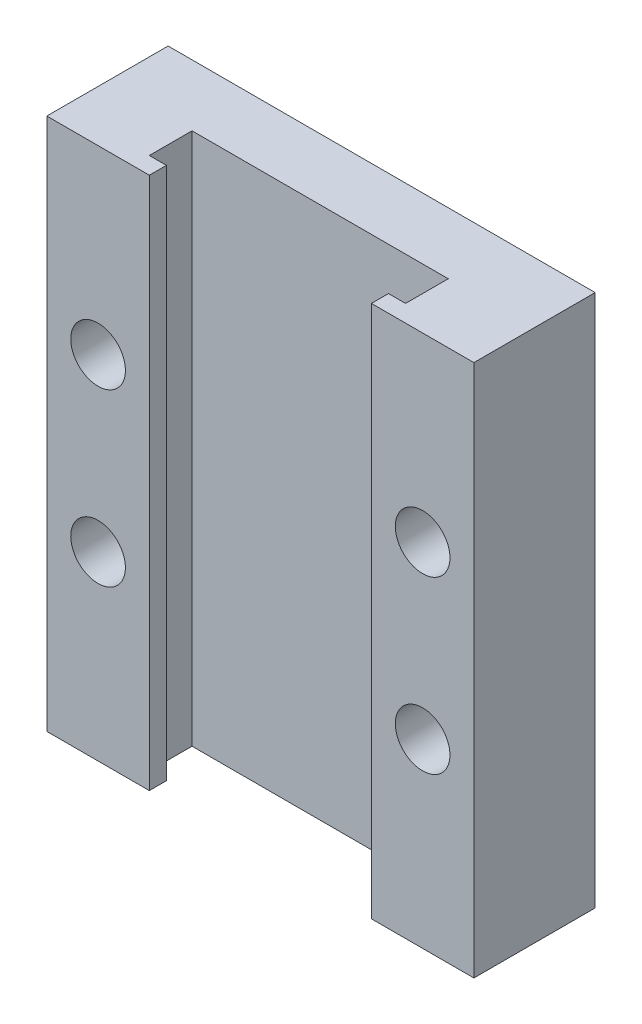
ISO-10303-21;
HEADER;
FILE_DESCRIPTION(('STEP AP214'),'2;1');
FILE_NAME('part.step','',(''),(''),'','','');
FILE_SCHEMA(('AUTOMOTIVE_DESIGN { 1 0 10303 214 1 1 1 1 }'));
ENDSEC;
DATA;
#1=APPLICATION_CONTEXT('core data for automotive mechanical design processes');
#2=APPLICATION_PROTOCOL_DEFINITION('international standard','automotive_design',2000,#1);
#3=PRODUCT_CONTEXT('',#1,'mechanical');
#4=PRODUCT('Part','Part','',(#3));
#5=PRODUCT_RELATED_PRODUCT_CATEGORY('part','',(#4));
#6=PRODUCT_DEFINITION_FORMATION('','',#4);
#7=PRODUCT_DEFINITION_CONTEXT('part definition',#1,'design');
#8=PRODUCT_DEFINITION('design','',#6,#7);
#9=PRODUCT_DEFINITION_SHAPE('','',#8);
#10=(LENGTH_UNIT() NAMED_UNIT(*) SI_UNIT(.MILLI.,.METRE.));
#11=(NAMED_UNIT(*) PLANE_ANGLE_UNIT() SI_UNIT($,.RADIAN.));
#12=(NAMED_UNIT(*) SI_UNIT($,.STERADIAN.) SOLID_ANGLE_UNIT());
#13=UNCERTAINTY_MEASURE_WITH_UNIT(LENGTH_MEASURE(1.E-05),#10,'distance_accuracy_value','');
#14=(GEOMETRIC_REPRESENTATION_CONTEXT(3) GLOBAL_UNCERTAINTY_ASSIGNED_CONTEXT((#13)) GLOBAL_UNIT_ASSIGNED_CONTEXT((#10,
#11,#12)) REPRESENTATION_CONTEXT('',''));
#15=CARTESIAN_POINT('',(0.,0.,0.));
#16=DIRECTION('',(0.,0.,1.));
#17=DIRECTION('',(1.,0.,0.));
#18=AXIS2_PLACEMENT_3D('',#15,#16,#17);
#19=CARTESIAN_POINT('',(-7.5,31.2,-2.22488312466121));
#20=DIRECTION('',(-1.,0.,0.));
#21=DIRECTION('',(0.,0.,1.));
#22=AXIS2_PLACEMENT_3D('',#19,#20,#21);
#23=PLANE('',#22);
#24=DIRECTION('',(0.,0.,-1.));
#25=VECTOR('',#24,1.);
#26=CARTESIAN_POINT('',(-7.5,0.,-2.22488312466121));
#27=LINE('',#26,#25);
#28=CARTESIAN_POINT('',(-7.5,0.,0.275116875338785));
#29=VERTEX_POINT('',#28);
#30=CARTESIAN_POINT('',(-7.5,0.,-2.22488312466121));
#31=VERTEX_POINT('',#30);
#32=EDGE_CURVE('E157',#29,#31,#27,.T.);
#33=ORIENTED_EDGE('',*,*,#32,.T.);
#34=DIRECTION('',(0.,-1.,0.));
#35=VECTOR('',#34,1.);
#36=CARTESIAN_POINT('',(-7.5,31.2,-2.22488312466121));
#37=LINE('',#36,#35);
#38=CARTESIAN_POINT('',(-7.5,31.2,-2.22488312466121));
#39=VERTEX_POINT('',#38);
#40=EDGE_CURVE('E11',#39,#31,#37,.T.);
#41=ORIENTED_EDGE('',*,*,#40,.F.);
#42=DIRECTION('',(0.,0.,-1.));
#43=VECTOR('',#42,1.);
#44=CARTESIAN_POINT('',(-7.5,31.2,-2.22488312466121));
#45=LINE('',#44,#43);
#46=CARTESIAN_POINT('',(-7.5,31.2,0.275116875338785));
#47=VERTEX_POINT('',#46);
#48=EDGE_CURVE('E180',#47,#39,#45,.T.);
#49=ORIENTED_EDGE('',*,*,#48,.F.);
#50=DIRECTION('',(0.,-1.,0.));
#51=VECTOR('',#50,1.);
#52=CARTESIAN_POINT('',(-7.5,31.2,0.275116875338785));
#53=LINE('',#52,#51);
#54=EDGE_CURVE('E153',#47,#29,#53,.T.);
#55=ORIENTED_EDGE('',*,*,#54,.T.);
#56=EDGE_LOOP('',(#33,#41,#49,#55));
#57=FACE_BOUND('',#56,.T.);
#58=ADVANCED_FACE('F35',(#57),#23,.F.);
#59=CARTESIAN_POINT('',(7.5,31.2,-2.22488312466122));
#60=DIRECTION('',(0.,0.,-1.));
#61=DIRECTION('',(-1.,0.,0.));
#62=AXIS2_PLACEMENT_3D('',#59,#60,#61);
#63=PLANE('',#62);
#64=DIRECTION('',(1.,0.,0.));
#65=VECTOR('',#64,1.);
#66=CARTESIAN_POINT('',(7.5,0.,-2.22488312466122));
#67=LINE('',#66,#65);
#68=CARTESIAN_POINT('',(7.5,0.,-2.22488312466122));
#69=VERTEX_POINT('',#68);
#70=EDGE_CURVE('E160',#31,#69,#67,.T.);
#71=ORIENTED_EDGE('',*,*,#70,.T.);
#72=DIRECTION('',(0.,-1.,0.));
#73=VECTOR('',#72,1.);
#74=CARTESIAN_POINT('',(7.5,31.2,-2.22488312466122));
#75=LINE('',#74,#73);
#76=CARTESIAN_POINT('',(7.5,31.2,-2.22488312466122));
#77=VERTEX_POINT('',#76);
#78=EDGE_CURVE('E44',#77,#69,#75,.T.);
#79=ORIENTED_EDGE('',*,*,#78,.F.);
#80=DIRECTION('',(1.,0.,0.));
#81=VECTOR('',#80,1.);
#82=CARTESIAN_POINT('',(7.5,31.2,-2.22488312466122));
#83=LINE('',#82,#81);
#84=EDGE_CURVE('E108',#39,#77,#83,.T.);
#85=ORIENTED_EDGE('',*,*,#84,.F.);
#86=ORIENTED_EDGE('',*,*,#40,.T.);
#87=EDGE_LOOP('',(#71,#79,#85,#86));
#88=FACE_BOUND('',#87,.T.);
#89=ADVANCED_FACE('F267',(#88),#63,.F.);
#90=CARTESIAN_POINT('',(7.5,31.2,-2.22488312466122));
#91=DIRECTION('',(1.,0.,0.));
#92=DIRECTION('',(0.,0.,-1.));
#93=AXIS2_PLACEMENT_3D('',#90,#91,#92);
#94=PLANE('',#93);
#95=DIRECTION('',(0.,0.,1.));
#96=VECTOR('',#95,1.);
#97=CARTESIAN_POINT('',(7.5,0.,-2.22488312466122));
#98=LINE('',#97,#96);
#99=CARTESIAN_POINT('',(7.5,0.,0.275116875338783));
#100=VERTEX_POINT('',#99);
#101=EDGE_CURVE('E163',#69,#100,#98,.T.);
#102=ORIENTED_EDGE('',*,*,#101,.T.);
#103=DIRECTION('',(0.,-1.,0.));
#104=VECTOR('',#103,1.);
#105=CARTESIAN_POINT('',(7.5,31.2,0.275116875338783));
#106=LINE('',#105,#104);
#107=CARTESIAN_POINT('',(7.5,31.2,0.275116875338783));
#108=VERTEX_POINT('',#107);
#109=EDGE_CURVE('E199',#108,#100,#106,.T.);
#110=ORIENTED_EDGE('',*,*,#109,.F.);
#111=DIRECTION('',(0.,0.,1.));
#112=VECTOR('',#111,1.);
#113=CARTESIAN_POINT('',(7.5,31.2,-2.22488312466122));
#114=LINE('',#113,#112);
#115=EDGE_CURVE('E228',#77,#108,#114,.T.);
#116=ORIENTED_EDGE('',*,*,#115,.F.);
#117=ORIENTED_EDGE('',*,*,#78,.T.);
#118=EDGE_LOOP('',(#102,#110,#116,#117));
#119=FACE_BOUND('',#118,.T.);
#120=ADVANCED_FACE('F271',(#119),#94,.F.);
#121=CARTESIAN_POINT('',(7.5,31.2,0.275116875338783));
#122=DIRECTION('',(0.,0.,1.));
#123=DIRECTION('',(1.,0.,0.));
#124=AXIS2_PLACEMENT_3D('',#121,#122,#123);
#125=PLANE('',#124);
#126=DIRECTION('',(-1.,0.,0.));
#127=VECTOR('',#126,1.);
#128=CARTESIAN_POINT('',(7.5,0.,0.275116875338783));
#129=LINE('',#128,#127);
#130=CARTESIAN_POINT('',(6.5,0.,0.275116875338784));
#131=VERTEX_POINT('',#130);
#132=EDGE_CURVE('E165',#100,#131,#129,.T.);
#133=ORIENTED_EDGE('',*,*,#132,.T.);
#134=DIRECTION('',(0.,-1.,0.));
#135=VECTOR('',#134,1.);
#136=CARTESIAN_POINT('',(6.5,31.2,0.275116875338784));
#137=LINE('',#136,#135);
#138=CARTESIAN_POINT('',(6.5,31.2,0.275116875338784));
#139=VERTEX_POINT('',#138);
#140=EDGE_CURVE('E196',#139,#131,#137,.T.);
#141=ORIENTED_EDGE('',*,*,#140,.F.);
#142=DIRECTION('',(-1.,0.,0.));
#143=VECTOR('',#142,1.);
#144=CARTESIAN_POINT('',(7.5,31.2,0.275116875338783));
#145=LINE('',#144,#143);
#146=EDGE_CURVE('E230',#108,#139,#145,.T.);
#147=ORIENTED_EDGE('',*,*,#146,.F.);
#148=ORIENTED_EDGE('',*,*,#109,.T.);
#149=EDGE_LOOP('',(#133,#141,#147,#148));
#150=FACE_BOUND('',#149,.T.);
#151=ADVANCED_FACE('F275',(#150),#125,.F.);
#152=CARTESIAN_POINT('',(6.5,31.2,0.275116875338784));
#153=DIRECTION('',(1.,0.,0.));
#154=DIRECTION('',(0.,0.,-1.));
#155=AXIS2_PLACEMENT_3D('',#152,#153,#154);
#156=PLANE('',#155);
#157=DIRECTION('',(0.,0.,1.));
#158=VECTOR('',#157,1.);
#159=CARTESIAN_POINT('',(6.5,0.,0.275116875338784));
#160=LINE('',#159,#158);
#161=CARTESIAN_POINT('',(6.5,0.,1.27511687533878));
#162=VERTEX_POINT('',#161);
#163=EDGE_CURVE('E167',#131,#162,#160,.T.);
#164=ORIENTED_EDGE('',*,*,#163,.T.);
#165=DIRECTION('',(0.,-1.,0.));
#166=VECTOR('',#165,1.);
#167=CARTESIAN_POINT('',(6.5,31.2,1.27511687533878));
#168=LINE('',#167,#166);
#169=CARTESIAN_POINT('',(6.5,31.2,1.27511687533878));
#170=VERTEX_POINT('',#169);
#171=EDGE_CURVE('E193',#170,#162,#168,.T.);
#172=ORIENTED_EDGE('',*,*,#171,.F.);
#173=DIRECTION('',(0.,0.,1.));
#174=VECTOR('',#173,1.);
#175=CARTESIAN_POINT('',(6.5,31.2,0.275116875338784));
#176=LINE('',#175,#174);
#177=EDGE_CURVE('E232',#139,#170,#176,.T.);
#178=ORIENTED_EDGE('',*,*,#177,.F.);
#179=ORIENTED_EDGE('',*,*,#140,.T.);
#180=EDGE_LOOP('',(#164,#172,#178,#179));
#181=FACE_BOUND('',#180,.T.);
#182=ADVANCED_FACE('F281',(#181),#156,.F.);
#183=CARTESIAN_POINT('',(6.5,31.2,1.27511687533878));
#184=DIRECTION('',(0.,0.,-1.));
#185=DIRECTION('',(-1.,0.,0.));
#186=AXIS2_PLACEMENT_3D('',#183,#184,#185);
#187=PLANE('',#186);
#188=CARTESIAN_POINT('',(9.5,10.6,1.27511687533878));
#189=DIRECTION('',(0.,0.,-1.));
#190=DIRECTION('',(-1.,0.,0.));
#191=AXIS2_PLACEMENT_3D('',#188,#189,#190);
#192=CIRCLE('',#191,1.6);
#193=CARTESIAN_POINT('',(7.9,10.6,1.27511687533878));
#194=VERTEX_POINT('',#193);
#195=EDGE_CURVE('E161',#194,#194,#192,.T.);
#196=ORIENTED_EDGE('',*,*,#195,.T.);
#197=EDGE_LOOP('',(#196));
#198=FACE_BOUND('',#197,.T.);
#199=CARTESIAN_POINT('',(9.5,20.6,1.27511687533878));
#200=DIRECTION('',(0.,0.,-1.));
#201=DIRECTION('',(-1.,0.,0.));
#202=AXIS2_PLACEMENT_3D('',#199,#200,#201);
#203=CIRCLE('',#202,1.6);
#204=CARTESIAN_POINT('',(7.9,20.6,1.27511687533878));
#205=VERTEX_POINT('',#204);
#206=EDGE_CURVE('E209',#205,#205,#203,.T.);
#207=ORIENTED_EDGE('',*,*,#206,.T.);
#208=EDGE_LOOP('',(#207));
#209=FACE_BOUND('',#208,.T.);
#210=DIRECTION('',(1.,0.,0.));
#211=VECTOR('',#210,1.);
#212=CARTESIAN_POINT('',(6.5,0.,1.27511687533878));
#213=LINE('',#212,#211);
#214=CARTESIAN_POINT('',(12.5,0.,1.27511687533878));
#215=VERTEX_POINT('',#214);
#216=EDGE_CURVE('E169',#162,#215,#213,.T.);
#217=ORIENTED_EDGE('',*,*,#216,.T.);
#218=DIRECTION('',(0.,-1.,0.));
#219=VECTOR('',#218,1.);
#220=CARTESIAN_POINT('',(12.5,31.2,1.27511687533878));
#221=LINE('',#220,#219);
#222=CARTESIAN_POINT('',(12.5,31.2,1.27511687533878));
#223=VERTEX_POINT('',#222);
#224=EDGE_CURVE('E190',#223,#215,#221,.T.);
#225=ORIENTED_EDGE('',*,*,#224,.F.);
#226=DIRECTION('',(1.,0.,0.));
#227=VECTOR('',#226,1.);
#228=CARTESIAN_POINT('',(6.5,31.2,1.27511687533878));
#229=LINE('',#228,#227);
#230=EDGE_CURVE('E234',#170,#223,#229,.T.);
#231=ORIENTED_EDGE('',*,*,#230,.F.);
#232=ORIENTED_EDGE('',*,*,#171,.T.);
#233=EDGE_LOOP('',(#217,#225,#231,#232));
#234=FACE_BOUND('',#233,.T.);
#235=ADVANCED_FACE('F285',(#198,#209,#234),#187,.F.);
#236=CARTESIAN_POINT('',(12.5,31.2,1.27511687533878));
#237=DIRECTION('',(-1.,0.,0.));
#238=DIRECTION('',(0.,0.,1.));
#239=AXIS2_PLACEMENT_3D('',#236,#237,#238);
#240=PLANE('',#239);
#241=DIRECTION('',(0.,0.,-1.));
#242=VECTOR('',#241,1.);
#243=CARTESIAN_POINT('',(12.5,0.,1.27511687533878));
#244=LINE('',#243,#242);
#245=CARTESIAN_POINT('',(12.5,0.,-5.82488312466122));
#246=VERTEX_POINT('',#245);
#247=EDGE_CURVE('E171',#215,#246,#244,.T.);
#248=ORIENTED_EDGE('',*,*,#247,.T.);
#249=DIRECTION('',(0.,-1.,0.));
#250=VECTOR('',#249,1.);
#251=CARTESIAN_POINT('',(12.5,31.2,-5.82488312466122));
#252=LINE('',#251,#250);
#253=CARTESIAN_POINT('',(12.5,31.2,-5.82488312466122));
#254=VERTEX_POINT('',#253);
#255=EDGE_CURVE('E187',#254,#246,#252,.T.);
#256=ORIENTED_EDGE('',*,*,#255,.F.);
#257=DIRECTION('',(0.,0.,-1.));
#258=VECTOR('',#257,1.);
#259=CARTESIAN_POINT('',(12.5,31.2,1.27511687533878));
#260=LINE('',#259,#258);
#261=EDGE_CURVE('E236',#223,#254,#260,.T.);
#262=ORIENTED_EDGE('',*,*,#261,.F.);
#263=ORIENTED_EDGE('',*,*,#224,.T.);
#264=EDGE_LOOP('',(#248,#256,#262,#263));
#265=FACE_BOUND('',#264,.T.);
#266=ADVANCED_FACE('F289',(#265),#240,.F.);
#267=CARTESIAN_POINT('',(-12.5,31.2,-5.82488312466121));
#268=DIRECTION('',(0.,0.,1.));
#269=DIRECTION('',(1.,0.,0.));
#270=AXIS2_PLACEMENT_3D('',#267,#268,#269);
#271=PLANE('',#270);
#272=CARTESIAN_POINT('',(9.5,10.6,-5.82488312466122));
#273=DIRECTION('',(0.,0.,-1.));
#274=DIRECTION('',(1.,0.,0.));
#275=AXIS2_PLACEMENT_3D('',#272,#273,#274);
#276=CIRCLE('',#275,1.6);
#277=CARTESIAN_POINT('',(11.1,10.6,-5.82488312466122));
#278=VERTEX_POINT('',#277);
#279=EDGE_CURVE('E220',#278,#278,#276,.T.);
#280=ORIENTED_EDGE('',*,*,#279,.F.);
#281=EDGE_LOOP('',(#280));
#282=FACE_BOUND('',#281,.T.);
#283=CARTESIAN_POINT('',(-9.5,10.6,-5.82488312466122));
#284=DIRECTION('',(0.,0.,-1.));
#285=DIRECTION('',(-1.,0.,0.));
#286=AXIS2_PLACEMENT_3D('',#283,#284,#285);
#287=CIRCLE('',#286,1.6);
#288=CARTESIAN_POINT('',(-11.1,10.6,-5.82488312466122));
#289=VERTEX_POINT('',#288);
#290=EDGE_CURVE('E216',#289,#289,#287,.T.);
#291=ORIENTED_EDGE('',*,*,#290,.F.);
#292=EDGE_LOOP('',(#291));
#293=FACE_BOUND('',#292,.T.);
#294=CARTESIAN_POINT('',(-9.5,20.6,-5.82488312466122));
#295=DIRECTION('',(0.,0.,-1.));
#296=DIRECTION('',(1.,0.,0.));
#297=AXIS2_PLACEMENT_3D('',#294,#295,#296);
#298=CIRCLE('',#297,1.6);
#299=CARTESIAN_POINT('',(-7.9,20.6,-5.82488312466122));
#300=VERTEX_POINT('',#299);
#301=EDGE_CURVE('E211',#300,#300,#298,.T.);
#302=ORIENTED_EDGE('',*,*,#301,.F.);
#303=EDGE_LOOP('',(#302));
#304=FACE_BOUND('',#303,.T.);
#305=CARTESIAN_POINT('',(9.5,20.6,-5.82488312466122));
#306=DIRECTION('',(0.,0.,-1.));
#307=DIRECTION('',(-1.,0.,0.));
#308=AXIS2_PLACEMENT_3D('',#305,#306,#307);
#309=CIRCLE('',#308,1.6);
#310=CARTESIAN_POINT('',(7.9,20.6,-5.82488312466122));
#311=VERTEX_POINT('',#310);
#312=EDGE_CURVE('E205',#311,#311,#309,.T.);
#313=ORIENTED_EDGE('',*,*,#312,.F.);
#314=EDGE_LOOP('',(#313));
#315=FACE_BOUND('',#314,.T.);
#316=DIRECTION('',(-1.,0.,0.));
#317=VECTOR('',#316,1.);
#318=CARTESIAN_POINT('',(-12.5,0.,-5.82488312466121));
#319=LINE('',#318,#317);
#320=CARTESIAN_POINT('',(-12.5,0.,-5.82488312466121));
#321=VERTEX_POINT('',#320);
#322=EDGE_CURVE('E173',#246,#321,#319,.T.);
#323=ORIENTED_EDGE('',*,*,#322,.T.);
#324=DIRECTION('',(0.,-1.,0.));
#325=VECTOR('',#324,1.);
#326=CARTESIAN_POINT('',(-12.5,31.2,-5.82488312466121));
#327=LINE('',#326,#325);
#328=CARTESIAN_POINT('',(-12.5,31.2,-5.82488312466121));
#329=VERTEX_POINT('',#328);
#330=EDGE_CURVE('E184',#329,#321,#327,.T.);
#331=ORIENTED_EDGE('',*,*,#330,.F.);
#332=DIRECTION('',(-1.,0.,0.));
#333=VECTOR('',#332,1.);
#334=CARTESIAN_POINT('',(-12.5,31.2,-5.82488312466121));
#335=LINE('',#334,#333);
#336=EDGE_CURVE('E238',#254,#329,#335,.T.);
#337=ORIENTED_EDGE('',*,*,#336,.F.);
#338=ORIENTED_EDGE('',*,*,#255,.T.);
#339=EDGE_LOOP('',(#323,#331,#337,#338));
#340=FACE_BOUND('',#339,.T.);
#341=ADVANCED_FACE('F244',(#282,#293,#304,#315,#340),#271,.F.);
#342=CARTESIAN_POINT('',(-12.5,31.2,1.27511687533879));
#343=DIRECTION('',(1.,0.,0.));
#344=DIRECTION('',(0.,0.,-1.));
#345=AXIS2_PLACEMENT_3D('',#342,#343,#344);
#346=PLANE('',#345);
#347=DIRECTION('',(0.,0.,1.));
#348=VECTOR('',#347,1.);
#349=CARTESIAN_POINT('',(-12.5,0.,1.27511687533879));
#350=LINE('',#349,#348);
#351=CARTESIAN_POINT('',(-12.5,0.,1.27511687533879));
#352=VERTEX_POINT('',#351);
#353=EDGE_CURVE('E175',#321,#352,#350,.T.);
#354=ORIENTED_EDGE('',*,*,#353,.T.);
#355=DIRECTION('',(0.,-1.,0.));
#356=VECTOR('',#355,1.);
#357=CARTESIAN_POINT('',(-12.5,31.2,1.27511687533879));
#358=LINE('',#357,#356);
#359=CARTESIAN_POINT('',(-12.5,31.2,1.27511687533879));
#360=VERTEX_POINT('',#359);
#361=EDGE_CURVE('E148',#360,#352,#358,.T.);
#362=ORIENTED_EDGE('',*,*,#361,.F.);
#363=DIRECTION('',(0.,0.,1.));
#364=VECTOR('',#363,1.);
#365=CARTESIAN_POINT('',(-12.5,31.2,1.27511687533879));
#366=LINE('',#365,#364);
#367=EDGE_CURVE('E139',#329,#360,#366,.T.);
#368=ORIENTED_EDGE('',*,*,#367,.F.);
#369=ORIENTED_EDGE('',*,*,#330,.T.);
#370=EDGE_LOOP('',(#354,#362,#368,#369));
#371=FACE_BOUND('',#370,.T.);
#372=ADVANCED_FACE('F248',(#371),#346,.F.);
#373=CARTESIAN_POINT('',(-6.5,31.2,1.27511687533879));
#374=DIRECTION('',(0.,0.,-1.));
#375=DIRECTION('',(-1.,0.,0.));
#376=AXIS2_PLACEMENT_3D('',#373,#374,#375);
#377=PLANE('',#376);
#378=CARTESIAN_POINT('',(-9.5,10.6,1.27511687533879));
#379=DIRECTION('',(0.,0.,-1.));
#380=DIRECTION('',(-1.,0.,0.));
#381=AXIS2_PLACEMENT_3D('',#378,#379,#380);
#382=CIRCLE('',#381,1.6);
#383=CARTESIAN_POINT('',(-11.1,10.6,1.27511687533879));
#384=VERTEX_POINT('',#383);
#385=EDGE_CURVE('E38',#384,#384,#382,.T.);
#386=ORIENTED_EDGE('',*,*,#385,.T.);
#387=EDGE_LOOP('',(#386));
#388=FACE_BOUND('',#387,.T.);
#389=CARTESIAN_POINT('',(-9.5,20.6,1.27511687533879));
#390=DIRECTION('',(0.,0.,-1.));
#391=DIRECTION('',(-1.,0.,0.));
#392=AXIS2_PLACEMENT_3D('',#389,#390,#391);
#393=CIRCLE('',#392,1.6);
#394=CARTESIAN_POINT('',(-11.1,20.6,1.27511687533879));
#395=VERTEX_POINT('',#394);
#396=EDGE_CURVE('E203',#395,#395,#393,.T.);
#397=ORIENTED_EDGE('',*,*,#396,.T.);
#398=EDGE_LOOP('',(#397));
#399=FACE_BOUND('',#398,.T.);
#400=DIRECTION('',(1.,0.,0.));
#401=VECTOR('',#400,1.);
#402=CARTESIAN_POINT('',(-6.5,0.,1.27511687533879));
#403=LINE('',#402,#401);
#404=CARTESIAN_POINT('',(-6.5,0.,1.27511687533879));
#405=VERTEX_POINT('',#404);
#406=EDGE_CURVE('E147',#352,#405,#403,.T.);
#407=ORIENTED_EDGE('',*,*,#406,.T.);
#408=DIRECTION('',(0.,-1.,0.));
#409=VECTOR('',#408,1.);
#410=CARTESIAN_POINT('',(-6.5,31.2,1.27511687533879));
#411=LINE('',#410,#409);
#412=CARTESIAN_POINT('',(-6.5,31.2,1.27511687533879));
#413=VERTEX_POINT('',#412);
#414=EDGE_CURVE('E144',#413,#405,#411,.T.);
#415=ORIENTED_EDGE('',*,*,#414,.F.);
#416=DIRECTION('',(1.,0.,0.));
#417=VECTOR('',#416,1.);
#418=CARTESIAN_POINT('',(-6.5,31.2,1.27511687533879));
#419=LINE('',#418,#417);
#420=EDGE_CURVE('E133',#360,#413,#419,.T.);
#421=ORIENTED_EDGE('',*,*,#420,.F.);
#422=ORIENTED_EDGE('',*,*,#361,.T.);
#423=EDGE_LOOP('',(#407,#415,#421,#422));
#424=FACE_BOUND('',#423,.T.);
#425=ADVANCED_FACE('F145',(#388,#399,#424),#377,.F.);
#426=CARTESIAN_POINT('',(-6.5,31.2,0.275116875338785));
#427=DIRECTION('',(-1.,0.,0.));
#428=DIRECTION('',(0.,0.,1.));
#429=AXIS2_PLACEMENT_3D('',#426,#427,#428);
#430=PLANE('',#429);
#431=DIRECTION('',(0.,0.,-1.));
#432=VECTOR('',#431,1.);
#433=CARTESIAN_POINT('',(-6.5,0.,0.275116875338785));
#434=LINE('',#433,#432);
#435=CARTESIAN_POINT('',(-6.5,0.,0.275116875338785));
#436=VERTEX_POINT('',#435);
#437=EDGE_CURVE('E94',#405,#436,#434,.T.);
#438=ORIENTED_EDGE('',*,*,#437,.T.);
#439=DIRECTION('',(0.,-1.,0.));
#440=VECTOR('',#439,1.);
#441=CARTESIAN_POINT('',(-6.5,31.2,0.275116875338785));
#442=LINE('',#441,#440);
#443=CARTESIAN_POINT('',(-6.5,31.2,0.275116875338785));
#444=VERTEX_POINT('',#443);
#445=EDGE_CURVE('E149',#444,#436,#442,.T.);
#446=ORIENTED_EDGE('',*,*,#445,.F.);
#447=DIRECTION('',(0.,0.,-1.));
#448=VECTOR('',#447,1.);
#449=CARTESIAN_POINT('',(-6.5,31.2,0.275116875338785));
#450=LINE('',#449,#448);
#451=EDGE_CURVE('E137',#413,#444,#450,.T.);
#452=ORIENTED_EDGE('',*,*,#451,.F.);
#453=ORIENTED_EDGE('',*,*,#414,.T.);
#454=EDGE_LOOP('',(#438,#446,#452,#453));
#455=FACE_BOUND('',#454,.T.);
#456=ADVANCED_FACE('F151',(#455),#430,.F.);
#457=CARTESIAN_POINT('',(-7.5,31.2,0.275116875338785));
#458=DIRECTION('',(0.,0.,1.));
#459=DIRECTION('',(1.,0.,0.));
#460=AXIS2_PLACEMENT_3D('',#457,#458,#459);
#461=PLANE('',#460);
#462=DIRECTION('',(-1.,0.,0.));
#463=VECTOR('',#462,1.);
#464=CARTESIAN_POINT('',(-7.5,0.,0.275116875338785));
#465=LINE('',#464,#463);
#466=EDGE_CURVE('E100',#436,#29,#465,.T.);
#467=ORIENTED_EDGE('',*,*,#466,.T.);
#468=ORIENTED_EDGE('',*,*,#54,.F.);
#469=DIRECTION('',(-1.,0.,0.));
#470=VECTOR('',#469,1.);
#471=CARTESIAN_POINT('',(-7.5,31.2,0.275116875338785));
#472=LINE('',#471,#470);
#473=EDGE_CURVE('E53',#444,#47,#472,.T.);
#474=ORIENTED_EDGE('',*,*,#473,.F.);
#475=ORIENTED_EDGE('',*,*,#445,.T.);
#476=EDGE_LOOP('',(#467,#468,#474,#475));
#477=FACE_BOUND('',#476,.T.);
#478=ADVANCED_FACE('F256',(#477),#461,.F.);
#479=CARTESIAN_POINT('',(0.,31.2,0.));
#480=DIRECTION('',(0.,1.,0.));
#481=DIRECTION('',(0.,0.,1.));
#482=AXIS2_PLACEMENT_3D('',#479,#480,#481);
#483=PLANE('',#482);
#484=ORIENTED_EDGE('',*,*,#48,.T.);
#485=ORIENTED_EDGE('',*,*,#84,.T.);
#486=ORIENTED_EDGE('',*,*,#115,.T.);
#487=ORIENTED_EDGE('',*,*,#146,.T.);
#488=ORIENTED_EDGE('',*,*,#177,.T.);
#489=ORIENTED_EDGE('',*,*,#230,.T.);
#490=ORIENTED_EDGE('',*,*,#261,.T.);
#491=ORIENTED_EDGE('',*,*,#336,.T.);
#492=ORIENTED_EDGE('',*,*,#367,.T.);
#493=ORIENTED_EDGE('',*,*,#420,.T.);
#494=ORIENTED_EDGE('',*,*,#451,.T.);
#495=ORIENTED_EDGE('',*,*,#473,.T.);
#496=EDGE_LOOP('',(#484,#485,#486,#487,#488,#489,#490,#491,#492,#493,#494,#495));
#497=FACE_BOUND('',#496,.T.);
#498=ADVANCED_FACE('F135',(#497),#483,.T.);
#499=CARTESIAN_POINT('',(0.,0.,0.));
#500=DIRECTION('',(0.,1.,0.));
#501=DIRECTION('',(0.,0.,1.));
#502=AXIS2_PLACEMENT_3D('',#499,#500,#501);
#503=PLANE('',#502);
#504=ORIENTED_EDGE('',*,*,#32,.F.);
#505=ORIENTED_EDGE('',*,*,#466,.F.);
#506=ORIENTED_EDGE('',*,*,#437,.F.);
#507=ORIENTED_EDGE('',*,*,#406,.F.);
#508=ORIENTED_EDGE('',*,*,#353,.F.);
#509=ORIENTED_EDGE('',*,*,#322,.F.);
#510=ORIENTED_EDGE('',*,*,#247,.F.);
#511=ORIENTED_EDGE('',*,*,#216,.F.);
#512=ORIENTED_EDGE('',*,*,#163,.F.);
#513=ORIENTED_EDGE('',*,*,#132,.F.);
#514=ORIENTED_EDGE('',*,*,#101,.F.);
#515=ORIENTED_EDGE('',*,*,#70,.F.);
#516=EDGE_LOOP('',(#504,#505,#506,#507,#508,#509,#510,#511,#512,#513,#514,#515));
#517=FACE_BOUND('',#516,.T.);
#518=ADVANCED_FACE('F251',(#517),#503,.F.);
#519=CARTESIAN_POINT('',(-9.5,20.6,4.17511687533878));
#520=DIRECTION('',(0.,0.,-1.));
#521=DIRECTION('',(-1.,0.,0.));
#522=AXIS2_PLACEMENT_3D('',#519,#520,#521);
#523=CYLINDRICAL_SURFACE('',#522,1.6);
#524=ORIENTED_EDGE('',*,*,#301,.T.);
#525=EDGE_LOOP('',(#524));
#526=FACE_BOUND('',#525,.T.);
#527=ORIENTED_EDGE('',*,*,#396,.F.);
#528=EDGE_LOOP('',(#527));
#529=FACE_BOUND('',#528,.T.);
#530=ADVANCED_FACE('F308',(#526,#529),#523,.F.);
#531=CARTESIAN_POINT('',(-9.5,10.6,4.17511687533878));
#532=DIRECTION('',(0.,0.,-1.));
#533=DIRECTION('',(-1.,0.,0.));
#534=AXIS2_PLACEMENT_3D('',#531,#532,#533);
#535=CYLINDRICAL_SURFACE('',#534,1.6);
#536=ORIENTED_EDGE('',*,*,#290,.T.);
#537=EDGE_LOOP('',(#536));
#538=FACE_BOUND('',#537,.T.);
#539=ORIENTED_EDGE('',*,*,#385,.F.);
#540=EDGE_LOOP('',(#539));
#541=FACE_BOUND('',#540,.T.);
#542=ADVANCED_FACE('F305',(#538,#541),#535,.F.);
#543=CARTESIAN_POINT('',(9.5,20.6,4.17511687533878));
#544=DIRECTION('',(0.,0.,-1.));
#545=DIRECTION('',(-1.,0.,0.));
#546=AXIS2_PLACEMENT_3D('',#543,#544,#545);
#547=CYLINDRICAL_SURFACE('',#546,1.6);
#548=ORIENTED_EDGE('',*,*,#312,.T.);
#549=EDGE_LOOP('',(#548));
#550=FACE_BOUND('',#549,.T.);
#551=ORIENTED_EDGE('',*,*,#206,.F.);
#552=EDGE_LOOP('',(#551));
#553=FACE_BOUND('',#552,.T.);
#554=ADVANCED_FACE('F307',(#550,#553),#547,.F.);
#555=CARTESIAN_POINT('',(9.5,10.6,4.17511687533878));
#556=DIRECTION('',(0.,0.,-1.));
#557=DIRECTION('',(-1.,0.,0.));
#558=AXIS2_PLACEMENT_3D('',#555,#556,#557);
#559=CYLINDRICAL_SURFACE('',#558,1.6);
#560=ORIENTED_EDGE('',*,*,#279,.T.);
#561=EDGE_LOOP('',(#560));
#562=FACE_BOUND('',#561,.T.);
#563=ORIENTED_EDGE('',*,*,#195,.F.);
#564=EDGE_LOOP('',(#563));
#565=FACE_BOUND('',#564,.T.);
#566=ADVANCED_FACE('F315',(#562,#565),#559,.F.);
#567=CLOSED_SHELL('',(#58,#89,#120,#151,#182,#235,#266,#341,#372,#425,#456,#478,#498,#518,#530,
#542,#554,#566));
#568=MANIFOLD_SOLID_BREP('B2',#567);
#569=ADVANCED_BREP_SHAPE_REPRESENTATION('',(#18,#568),#14);
#570=SHAPE_DEFINITION_REPRESENTATION(#9,#569);
ENDSEC;
END-ISO-10303-21;
